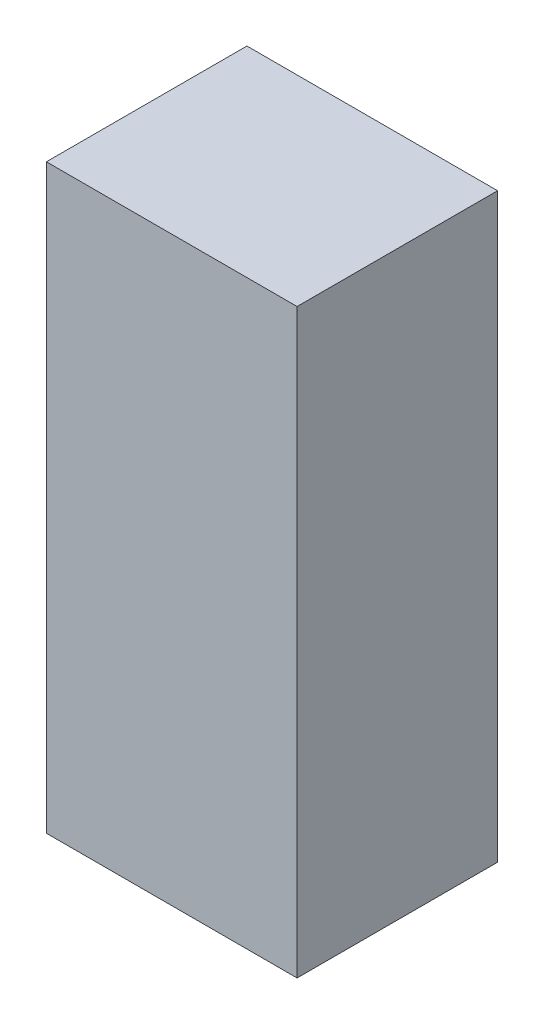
ISO-10303-21;
HEADER;
FILE_DESCRIPTION(('STEP AP214'),'2;1');
FILE_NAME('part.step','',(''),(''),'','','');
FILE_SCHEMA(('AUTOMOTIVE_DESIGN { 1 0 10303 214 1 1 1 1 }'));
ENDSEC;
DATA;
#1=APPLICATION_CONTEXT('core data for automotive mechanical design processes');
#2=APPLICATION_PROTOCOL_DEFINITION('international standard','automotive_design',2000,#1);
#3=PRODUCT_CONTEXT('',#1,'mechanical');
#4=PRODUCT('Part','Part','',(#3));
#5=PRODUCT_RELATED_PRODUCT_CATEGORY('part','',(#4));
#6=PRODUCT_DEFINITION_FORMATION('','',#4);
#7=PRODUCT_DEFINITION_CONTEXT('part definition',#1,'design');
#8=PRODUCT_DEFINITION('design','',#6,#7);
#9=PRODUCT_DEFINITION_SHAPE('','',#8);
#10=(LENGTH_UNIT() NAMED_UNIT(*) SI_UNIT(.MILLI.,.METRE.));
#11=(NAMED_UNIT(*) PLANE_ANGLE_UNIT() SI_UNIT($,.RADIAN.));
#12=(NAMED_UNIT(*) SI_UNIT($,.STERADIAN.) SOLID_ANGLE_UNIT());
#13=UNCERTAINTY_MEASURE_WITH_UNIT(LENGTH_MEASURE(1.E-05),#10,'distance_accuracy_value','');
#14=(GEOMETRIC_REPRESENTATION_CONTEXT(3) GLOBAL_UNCERTAINTY_ASSIGNED_CONTEXT((#13)) GLOBAL_UNIT_ASSIGNED_CONTEXT((#10,
#11,#12)) REPRESENTATION_CONTEXT('',''));
#15=CARTESIAN_POINT('',(0.,0.,0.));
#16=DIRECTION('',(0.,0.,1.));
#17=DIRECTION('',(1.,0.,0.));
#18=AXIS2_PLACEMENT_3D('',#15,#16,#17);
#19=CARTESIAN_POINT('',(-12.5,-29.,20.));
#20=DIRECTION('',(0.,0.,1.));
#21=DIRECTION('',(1.,0.,0.));
#22=AXIS2_PLACEMENT_3D('',#19,#20,#21);
#23=PLANE('',#22);
#24=DIRECTION('',(0.,1.,0.));
#25=VECTOR('',#24,1.);
#26=CARTESIAN_POINT('',(-12.5,-29.,20.));
#27=LINE('',#26,#25);
#28=CARTESIAN_POINT('',(-12.5,-29.,20.));
#29=VERTEX_POINT('',#28);
#30=CARTESIAN_POINT('',(-12.5,29.,20.));
#31=VERTEX_POINT('',#30);
#32=EDGE_CURVE('E105',#29,#31,#27,.T.);
#33=ORIENTED_EDGE('',*,*,#32,.F.);
#34=DIRECTION('',(1.,0.,0.));
#35=VECTOR('',#34,1.);
#36=CARTESIAN_POINT('',(-12.5,-29.,20.));
#37=LINE('',#36,#35);
#38=CARTESIAN_POINT('',(12.5,-29.,20.));
#39=VERTEX_POINT('',#38);
#40=EDGE_CURVE('E77',#29,#39,#37,.T.);
#41=ORIENTED_EDGE('',*,*,#40,.T.);
#42=DIRECTION('',(0.,1.,0.));
#43=VECTOR('',#42,1.);
#44=CARTESIAN_POINT('',(12.5,-29.,20.));
#45=LINE('',#44,#43);
#46=CARTESIAN_POINT('',(12.5,29.,20.));
#47=VERTEX_POINT('',#46);
#48=EDGE_CURVE('E88',#39,#47,#45,.T.);
#49=ORIENTED_EDGE('',*,*,#48,.T.);
#50=DIRECTION('',(1.,0.,0.));
#51=VECTOR('',#50,1.);
#52=CARTESIAN_POINT('',(-12.5,29.,20.));
#53=LINE('',#52,#51);
#54=EDGE_CURVE('E10',#31,#47,#53,.T.);
#55=ORIENTED_EDGE('',*,*,#54,.F.);
#56=EDGE_LOOP('',(#33,#41,#49,#55));
#57=FACE_BOUND('',#56,.T.);
#58=ADVANCED_FACE('F16',(#57),#23,.T.);
#59=CARTESIAN_POINT('',(-12.5,-29.,0.));
#60=DIRECTION('',(0.,0.,1.));
#61=DIRECTION('',(1.,0.,0.));
#62=AXIS2_PLACEMENT_3D('',#59,#60,#61);
#63=PLANE('',#62);
#64=DIRECTION('',(1.,0.,0.));
#65=VECTOR('',#64,1.);
#66=CARTESIAN_POINT('',(-12.5,29.,0.));
#67=LINE('',#66,#65);
#68=CARTESIAN_POINT('',(-12.5,29.,0.));
#69=VERTEX_POINT('',#68);
#70=CARTESIAN_POINT('',(12.5,29.,0.));
#71=VERTEX_POINT('',#70);
#72=EDGE_CURVE('E20',#69,#71,#67,.T.);
#73=ORIENTED_EDGE('',*,*,#72,.T.);
#74=DIRECTION('',(0.,1.,0.));
#75=VECTOR('',#74,1.);
#76=CARTESIAN_POINT('',(12.5,-29.,0.));
#77=LINE('',#76,#75);
#78=CARTESIAN_POINT('',(12.5,-29.,0.));
#79=VERTEX_POINT('',#78);
#80=EDGE_CURVE('E80',#79,#71,#77,.T.);
#81=ORIENTED_EDGE('',*,*,#80,.F.);
#82=DIRECTION('',(1.,0.,0.));
#83=VECTOR('',#82,1.);
#84=CARTESIAN_POINT('',(-12.5,-29.,0.));
#85=LINE('',#84,#83);
#86=CARTESIAN_POINT('',(-12.5,-29.,0.));
#87=VERTEX_POINT('',#86);
#88=EDGE_CURVE('E66',#87,#79,#85,.T.);
#89=ORIENTED_EDGE('',*,*,#88,.F.);
#90=DIRECTION('',(0.,1.,0.));
#91=VECTOR('',#90,1.);
#92=CARTESIAN_POINT('',(-12.5,-29.,0.));
#93=LINE('',#92,#91);
#94=EDGE_CURVE('E94',#87,#69,#93,.T.);
#95=ORIENTED_EDGE('',*,*,#94,.T.);
#96=EDGE_LOOP('',(#73,#81,#89,#95));
#97=FACE_BOUND('',#96,.T.);
#98=ADVANCED_FACE('F18',(#97),#63,.F.);
#99=CARTESIAN_POINT('',(-12.5,29.,0.));
#100=DIRECTION('',(0.,1.,0.));
#101=DIRECTION('',(1.,0.,0.));
#102=AXIS2_PLACEMENT_3D('',#99,#100,#101);
#103=PLANE('',#102);
#104=ORIENTED_EDGE('',*,*,#72,.F.);
#105=DIRECTION('',(0.,0.,1.));
#106=VECTOR('',#105,1.);
#107=CARTESIAN_POINT('',(-12.5,29.,0.));
#108=LINE('',#107,#106);
#109=EDGE_CURVE('E109',#69,#31,#108,.T.);
#110=ORIENTED_EDGE('',*,*,#109,.T.);
#111=ORIENTED_EDGE('',*,*,#54,.T.);
#112=DIRECTION('',(0.,0.,1.));
#113=VECTOR('',#112,1.);
#114=CARTESIAN_POINT('',(12.5,29.,0.));
#115=LINE('',#114,#113);
#116=EDGE_CURVE('E84',#71,#47,#115,.T.);
#117=ORIENTED_EDGE('',*,*,#116,.F.);
#118=EDGE_LOOP('',(#104,#110,#111,#117));
#119=FACE_BOUND('',#118,.T.);
#120=ADVANCED_FACE('F121',(#119),#103,.T.);
#121=CARTESIAN_POINT('',(-12.5,-29.,0.));
#122=DIRECTION('',(0.,1.,0.));
#123=DIRECTION('',(1.,0.,0.));
#124=AXIS2_PLACEMENT_3D('',#121,#122,#123);
#125=PLANE('',#124);
#126=DIRECTION('',(0.,0.,1.));
#127=VECTOR('',#126,1.);
#128=CARTESIAN_POINT('',(12.5,-29.,0.));
#129=LINE('',#128,#127);
#130=EDGE_CURVE('E70',#79,#39,#129,.T.);
#131=ORIENTED_EDGE('',*,*,#130,.T.);
#132=ORIENTED_EDGE('',*,*,#40,.F.);
#133=DIRECTION('',(0.,0.,1.));
#134=VECTOR('',#133,1.);
#135=CARTESIAN_POINT('',(-12.5,-29.,0.));
#136=LINE('',#135,#134);
#137=EDGE_CURVE('E72',#87,#29,#136,.T.);
#138=ORIENTED_EDGE('',*,*,#137,.F.);
#139=ORIENTED_EDGE('',*,*,#88,.T.);
#140=EDGE_LOOP('',(#131,#132,#138,#139));
#141=FACE_BOUND('',#140,.T.);
#142=ADVANCED_FACE('F68',(#141),#125,.F.);
#143=CARTESIAN_POINT('',(12.5,-29.,0.));
#144=DIRECTION('',(1.,0.,0.));
#145=DIRECTION('',(0.,1.,0.));
#146=AXIS2_PLACEMENT_3D('',#143,#144,#145);
#147=PLANE('',#146);
#148=ORIENTED_EDGE('',*,*,#130,.F.);
#149=ORIENTED_EDGE('',*,*,#80,.T.);
#150=ORIENTED_EDGE('',*,*,#116,.T.);
#151=ORIENTED_EDGE('',*,*,#48,.F.);
#152=EDGE_LOOP('',(#148,#149,#150,#151));
#153=FACE_BOUND('',#152,.T.);
#154=ADVANCED_FACE('F87',(#153),#147,.T.);
#155=CARTESIAN_POINT('',(-12.5,-29.,0.));
#156=DIRECTION('',(1.,0.,0.));
#157=DIRECTION('',(0.,1.,0.));
#158=AXIS2_PLACEMENT_3D('',#155,#156,#157);
#159=PLANE('',#158);
#160=ORIENTED_EDGE('',*,*,#32,.T.);
#161=ORIENTED_EDGE('',*,*,#109,.F.);
#162=ORIENTED_EDGE('',*,*,#94,.F.);
#163=ORIENTED_EDGE('',*,*,#137,.T.);
#164=EDGE_LOOP('',(#160,#161,#162,#163));
#165=FACE_BOUND('',#164,.T.);
#166=ADVANCED_FACE('F107',(#165),#159,.F.);
#167=CLOSED_SHELL('',(#58,#98,#120,#142,#154,#166));
#168=MANIFOLD_SOLID_BREP('B1',#167);
#169=ADVANCED_BREP_SHAPE_REPRESENTATION('',(#18,#168),#14);
#170=SHAPE_DEFINITION_REPRESENTATION(#9,#169);
ENDSEC;
END-ISO-10303-21;
